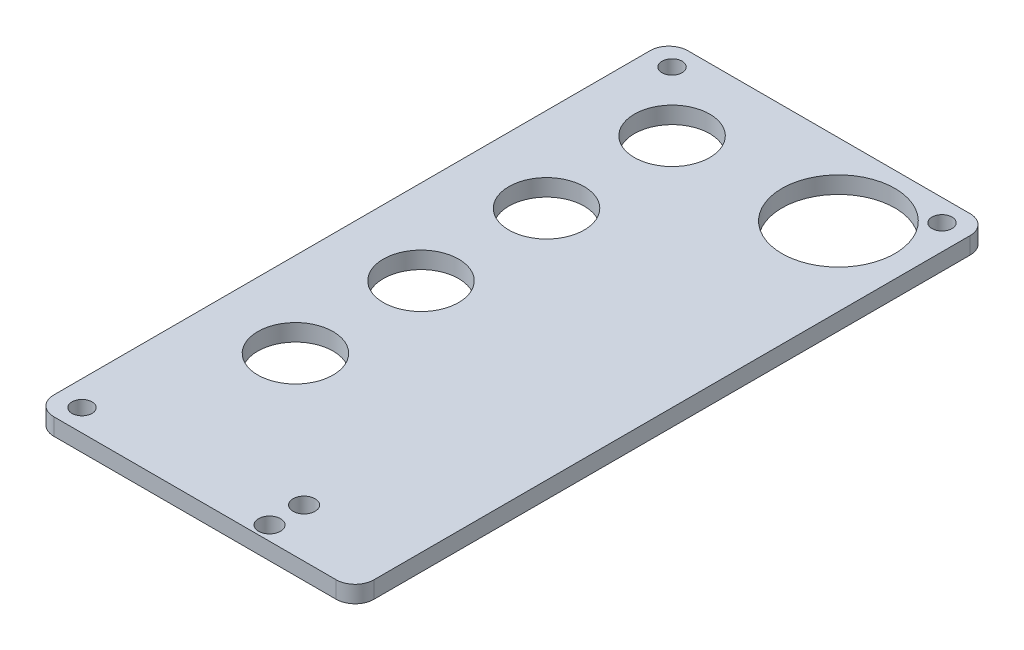
ISO-10303-21;
HEADER;
FILE_DESCRIPTION(('STEP AP214'),'2;1');
FILE_NAME('part.step','',(''),(''),'','','');
FILE_SCHEMA(('AUTOMOTIVE_DESIGN { 1 0 10303 214 1 1 1 1 }'));
ENDSEC;
DATA;
#1=APPLICATION_CONTEXT('core data for automotive mechanical design processes');
#2=APPLICATION_PROTOCOL_DEFINITION('international standard','automotive_design',2000,#1);
#3=PRODUCT_CONTEXT('',#1,'mechanical');
#4=PRODUCT('Part','Part','',(#3));
#5=PRODUCT_RELATED_PRODUCT_CATEGORY('part','',(#4));
#6=PRODUCT_DEFINITION_FORMATION('','',#4);
#7=PRODUCT_DEFINITION_CONTEXT('part definition',#1,'design');
#8=PRODUCT_DEFINITION('design','',#6,#7);
#9=PRODUCT_DEFINITION_SHAPE('','',#8);
#10=(LENGTH_UNIT() NAMED_UNIT(*) SI_UNIT(.MILLI.,.METRE.));
#11=(NAMED_UNIT(*) PLANE_ANGLE_UNIT() SI_UNIT($,.RADIAN.));
#12=(NAMED_UNIT(*) SI_UNIT($,.STERADIAN.) SOLID_ANGLE_UNIT());
#13=UNCERTAINTY_MEASURE_WITH_UNIT(LENGTH_MEASURE(1.E-05),#10,'distance_accuracy_value','');
#14=(GEOMETRIC_REPRESENTATION_CONTEXT(3) GLOBAL_UNCERTAINTY_ASSIGNED_CONTEXT((#13)) GLOBAL_UNIT_ASSIGNED_CONTEXT((#10,
#11,#12)) REPRESENTATION_CONTEXT('',''));
#15=CARTESIAN_POINT('',(0.,0.,0.));
#16=DIRECTION('',(0.,0.,1.));
#17=DIRECTION('',(1.,0.,0.));
#18=AXIS2_PLACEMENT_3D('',#15,#16,#17);
#19=CARTESIAN_POINT('',(0.,0.,0.));
#20=DIRECTION('',(0.,1.,0.));
#21=DIRECTION('',(1.,0.,0.));
#22=AXIS2_PLACEMENT_3D('',#19,#20,#21);
#23=PLANE('',#22);
#24=DIRECTION('',(-1.,0.,0.));
#25=VECTOR('',#24,1.);
#26=CARTESIAN_POINT('',(22.5,0.,-50.5));
#27=LINE('',#26,#25);
#28=CARTESIAN_POINT('',(22.5,0.,-50.5));
#29=VERTEX_POINT('',#28);
#30=CARTESIAN_POINT('',(-22.5,0.,-50.5));
#31=VERTEX_POINT('',#30);
#32=EDGE_CURVE('E35',#29,#31,#27,.T.);
#33=ORIENTED_EDGE('',*,*,#32,.F.);
#34=CARTESIAN_POINT('',(22.5,0.,-47.5));
#35=DIRECTION('',(0.,-1.,0.));
#36=DIRECTION('',(0.,0.,-1.));
#37=AXIS2_PLACEMENT_3D('',#34,#35,#36);
#38=CIRCLE('',#37,3.);
#39=CARTESIAN_POINT('',(25.5,0.,-47.5));
#40=VERTEX_POINT('',#39);
#41=EDGE_CURVE('E11',#29,#40,#38,.T.);
#42=ORIENTED_EDGE('',*,*,#41,.T.);
#43=DIRECTION('',(0.,0.,-1.));
#44=VECTOR('',#43,1.);
#45=CARTESIAN_POINT('',(25.5,0.,47.5));
#46=LINE('',#45,#44);
#47=CARTESIAN_POINT('',(25.5,0.,47.5));
#48=VERTEX_POINT('',#47);
#49=EDGE_CURVE('E120',#48,#40,#46,.T.);
#50=ORIENTED_EDGE('',*,*,#49,.F.);
#51=CARTESIAN_POINT('',(22.5,0.,47.5));
#52=DIRECTION('',(0.,-1.,0.));
#53=DIRECTION('',(1.,0.,0.));
#54=AXIS2_PLACEMENT_3D('',#51,#52,#53);
#55=CIRCLE('',#54,3.);
#56=CARTESIAN_POINT('',(22.5,0.,50.5));
#57=VERTEX_POINT('',#56);
#58=EDGE_CURVE('E27',#48,#57,#55,.T.);
#59=ORIENTED_EDGE('',*,*,#58,.T.);
#60=DIRECTION('',(1.,0.,0.));
#61=VECTOR('',#60,1.);
#62=CARTESIAN_POINT('',(-22.5,0.,50.5));
#63=LINE('',#62,#61);
#64=CARTESIAN_POINT('',(-22.5,0.,50.5));
#65=VERTEX_POINT('',#64);
#66=EDGE_CURVE('E123',#65,#57,#63,.T.);
#67=ORIENTED_EDGE('',*,*,#66,.F.);
#68=CARTESIAN_POINT('',(-22.5,0.,47.5));
#69=DIRECTION('',(0.,-1.,0.));
#70=DIRECTION('',(0.,0.,1.));
#71=AXIS2_PLACEMENT_3D('',#68,#69,#70);
#72=CIRCLE('',#71,3.);
#73=CARTESIAN_POINT('',(-25.5,0.,47.5));
#74=VERTEX_POINT('',#73);
#75=EDGE_CURVE('E139',#65,#74,#72,.T.);
#76=ORIENTED_EDGE('',*,*,#75,.T.);
#77=DIRECTION('',(0.,0.,1.));
#78=VECTOR('',#77,1.);
#79=CARTESIAN_POINT('',(-25.5,0.,-47.5));
#80=LINE('',#79,#78);
#81=CARTESIAN_POINT('',(-25.5,0.,-47.5));
#82=VERTEX_POINT('',#81);
#83=EDGE_CURVE('E130',#82,#74,#80,.T.);
#84=ORIENTED_EDGE('',*,*,#83,.F.);
#85=CARTESIAN_POINT('',(-22.5,0.,-47.5));
#86=DIRECTION('',(0.,-1.,0.));
#87=DIRECTION('',(-1.,0.,0.));
#88=AXIS2_PLACEMENT_3D('',#85,#86,#87);
#89=CIRCLE('',#88,3.);
#90=EDGE_CURVE('E140',#82,#31,#89,.T.);
#91=ORIENTED_EDGE('',*,*,#90,.T.);
#92=EDGE_LOOP('',(#33,#42,#50,#59,#67,#76,#84,#91));
#93=FACE_BOUND('',#92,.T.);
#94=CARTESIAN_POINT('',(21.5,0.,-47.));
#95=DIRECTION('',(0.,-1.,0.));
#96=DIRECTION('',(-1.,0.,0.));
#97=AXIS2_PLACEMENT_3D('',#94,#95,#96);
#98=CIRCLE('',#97,1.6);
#99=CARTESIAN_POINT('',(19.9,0.,-47.));
#100=VERTEX_POINT('',#99);
#101=EDGE_CURVE('E142',#100,#100,#98,.T.);
#102=ORIENTED_EDGE('',*,*,#101,.F.);
#103=EDGE_LOOP('',(#102));
#104=FACE_BOUND('',#103,.T.);
#105=CARTESIAN_POINT('',(-21.5,0.,-47.));
#106=DIRECTION('',(0.,-1.,0.));
#107=DIRECTION('',(-1.,0.,0.));
#108=AXIS2_PLACEMENT_3D('',#105,#106,#107);
#109=CIRCLE('',#108,1.6);
#110=CARTESIAN_POINT('',(-23.1,0.,-47.));
#111=VERTEX_POINT('',#110);
#112=EDGE_CURVE('E146',#111,#111,#109,.T.);
#113=ORIENTED_EDGE('',*,*,#112,.F.);
#114=EDGE_LOOP('',(#113));
#115=FACE_BOUND('',#114,.T.);
#116=CARTESIAN_POINT('',(-21.5,0.,47.));
#117=DIRECTION('',(0.,-1.,0.));
#118=DIRECTION('',(-1.,0.,0.));
#119=AXIS2_PLACEMENT_3D('',#116,#117,#118);
#120=CIRCLE('',#119,1.6);
#121=CARTESIAN_POINT('',(-23.1,0.,47.));
#122=VERTEX_POINT('',#121);
#123=EDGE_CURVE('E150',#122,#122,#120,.T.);
#124=ORIENTED_EDGE('',*,*,#123,.F.);
#125=EDGE_LOOP('',(#124));
#126=FACE_BOUND('',#125,.T.);
#127=CARTESIAN_POINT('',(-12.,0.,-37.5));
#128=DIRECTION('',(0.,-1.,0.));
#129=DIRECTION('',(-1.,0.,0.));
#130=AXIS2_PLACEMENT_3D('',#127,#128,#129);
#131=CIRCLE('',#130,6.);
#132=CARTESIAN_POINT('',(-18.,0.,-37.5));
#133=VERTEX_POINT('',#132);
#134=EDGE_CURVE('E153',#133,#133,#131,.T.);
#135=ORIENTED_EDGE('',*,*,#134,.F.);
#136=EDGE_LOOP('',(#135));
#137=FACE_BOUND('',#136,.T.);
#138=CARTESIAN_POINT('',(-12.,0.,-17.5));
#139=DIRECTION('',(0.,-1.,0.));
#140=DIRECTION('',(-1.,0.,0.));
#141=AXIS2_PLACEMENT_3D('',#138,#139,#140);
#142=CIRCLE('',#141,6.);
#143=CARTESIAN_POINT('',(-18.,0.,-17.5));
#144=VERTEX_POINT('',#143);
#145=EDGE_CURVE('E156',#144,#144,#142,.T.);
#146=ORIENTED_EDGE('',*,*,#145,.F.);
#147=EDGE_LOOP('',(#146));
#148=FACE_BOUND('',#147,.T.);
#149=CARTESIAN_POINT('',(-12.,0.,2.5));
#150=DIRECTION('',(0.,-1.,0.));
#151=DIRECTION('',(-1.,0.,0.));
#152=AXIS2_PLACEMENT_3D('',#149,#150,#151);
#153=CIRCLE('',#152,6.);
#154=CARTESIAN_POINT('',(-18.,0.,2.5));
#155=VERTEX_POINT('',#154);
#156=EDGE_CURVE('E159',#155,#155,#153,.T.);
#157=ORIENTED_EDGE('',*,*,#156,.F.);
#158=EDGE_LOOP('',(#157));
#159=FACE_BOUND('',#158,.T.);
#160=CARTESIAN_POINT('',(-12.,0.,22.5));
#161=DIRECTION('',(0.,-1.,0.));
#162=DIRECTION('',(-1.,0.,0.));
#163=AXIS2_PLACEMENT_3D('',#160,#161,#162);
#164=CIRCLE('',#163,6.);
#165=CARTESIAN_POINT('',(-18.,0.,22.5));
#166=VERTEX_POINT('',#165);
#167=EDGE_CURVE('E162',#166,#166,#164,.T.);
#168=ORIENTED_EDGE('',*,*,#167,.F.);
#169=EDGE_LOOP('',(#168));
#170=FACE_BOUND('',#169,.T.);
#171=CARTESIAN_POINT('',(13.,0.,-39.));
#172=DIRECTION('',(0.,-1.,0.));
#173=DIRECTION('',(-1.,0.,0.));
#174=AXIS2_PLACEMENT_3D('',#171,#172,#173);
#175=CIRCLE('',#174,9.);
#176=CARTESIAN_POINT('',(4.,0.,-39.));
#177=VERTEX_POINT('',#176);
#178=EDGE_CURVE('E165',#177,#177,#175,.T.);
#179=ORIENTED_EDGE('',*,*,#178,.F.);
#180=EDGE_LOOP('',(#179));
#181=FACE_BOUND('',#180,.T.);
#182=CARTESIAN_POINT('',(9.624,0.,42.75));
#183=DIRECTION('',(0.,-1.,0.));
#184=DIRECTION('',(-1.,0.,0.));
#185=AXIS2_PLACEMENT_3D('',#182,#183,#184);
#186=CIRCLE('',#185,1.75);
#187=CARTESIAN_POINT('',(7.874,0.,42.75));
#188=VERTEX_POINT('',#187);
#189=EDGE_CURVE('E108',#188,#188,#186,.T.);
#190=ORIENTED_EDGE('',*,*,#189,.F.);
#191=EDGE_LOOP('',(#190));
#192=FACE_BOUND('',#191,.T.);
#193=CARTESIAN_POINT('',(9.624,0.,48.25));
#194=DIRECTION('',(0.,-1.,0.));
#195=DIRECTION('',(-1.,0.,0.));
#196=AXIS2_PLACEMENT_3D('',#193,#194,#195);
#197=CIRCLE('',#196,1.75);
#198=CARTESIAN_POINT('',(7.874,0.,48.25));
#199=VERTEX_POINT('',#198);
#200=EDGE_CURVE('E104',#199,#199,#197,.T.);
#201=ORIENTED_EDGE('',*,*,#200,.F.);
#202=EDGE_LOOP('',(#201));
#203=FACE_BOUND('',#202,.T.);
#204=ADVANCED_FACE('F17',(#93,#104,#115,#126,#137,#148,#159,#170,#181,#192,#203),#23,.F.);
#205=CARTESIAN_POINT('',(21.5,0.,-47.));
#206=DIRECTION('',(0.,1.,0.));
#207=DIRECTION('',(1.,0.,0.));
#208=AXIS2_PLACEMENT_3D('',#205,#206,#207);
#209=CYLINDRICAL_SURFACE('',#208,1.6);
#210=CARTESIAN_POINT('',(21.5,2.7,-47.));
#211=DIRECTION('',(0.,-1.,0.));
#212=DIRECTION('',(1.,0.,0.));
#213=AXIS2_PLACEMENT_3D('',#210,#211,#212);
#214=CIRCLE('',#213,1.6);
#215=CARTESIAN_POINT('',(23.1,2.7,-47.));
#216=VERTEX_POINT('',#215);
#217=EDGE_CURVE('E95',#216,#216,#214,.T.);
#218=ORIENTED_EDGE('',*,*,#217,.F.);
#219=EDGE_LOOP('',(#218));
#220=FACE_BOUND('',#219,.T.);
#221=ORIENTED_EDGE('',*,*,#101,.T.);
#222=EDGE_LOOP('',(#221));
#223=FACE_BOUND('',#222,.T.);
#224=ADVANCED_FACE('F220',(#220,#223),#209,.F.);
#225=CARTESIAN_POINT('',(0.,2.7,0.));
#226=DIRECTION('',(0.,1.,0.));
#227=DIRECTION('',(1.,0.,0.));
#228=AXIS2_PLACEMENT_3D('',#225,#226,#227);
#229=PLANE('',#228);
#230=DIRECTION('',(0.,0.,1.));
#231=VECTOR('',#230,1.);
#232=CARTESIAN_POINT('',(-25.5,2.7,-47.5));
#233=LINE('',#232,#231);
#234=CARTESIAN_POINT('',(-25.5,2.7,-47.5));
#235=VERTEX_POINT('',#234);
#236=CARTESIAN_POINT('',(-25.5,2.7,47.5));
#237=VERTEX_POINT('',#236);
#238=EDGE_CURVE('E145',#235,#237,#233,.T.);
#239=ORIENTED_EDGE('',*,*,#238,.T.);
#240=CARTESIAN_POINT('',(-22.5,2.7,47.5));
#241=DIRECTION('',(0.,1.,0.));
#242=DIRECTION('',(-1.,0.,0.));
#243=AXIS2_PLACEMENT_3D('',#240,#241,#242);
#244=CIRCLE('',#243,3.);
#245=CARTESIAN_POINT('',(-22.5,2.7,50.5));
#246=VERTEX_POINT('',#245);
#247=EDGE_CURVE('E174',#237,#246,#244,.T.);
#248=ORIENTED_EDGE('',*,*,#247,.T.);
#249=DIRECTION('',(1.,0.,0.));
#250=VECTOR('',#249,1.);
#251=CARTESIAN_POINT('',(-22.5,2.7,50.5));
#252=LINE('',#251,#250);
#253=CARTESIAN_POINT('',(22.5,2.7,50.5));
#254=VERTEX_POINT('',#253);
#255=EDGE_CURVE('E177',#246,#254,#252,.T.);
#256=ORIENTED_EDGE('',*,*,#255,.T.);
#257=CARTESIAN_POINT('',(22.5,2.7,47.5));
#258=DIRECTION('',(0.,1.,0.));
#259=DIRECTION('',(0.,0.,1.));
#260=AXIS2_PLACEMENT_3D('',#257,#258,#259);
#261=CIRCLE('',#260,3.);
#262=CARTESIAN_POINT('',(25.5,2.7,47.5));
#263=VERTEX_POINT('',#262);
#264=EDGE_CURVE('E180',#254,#263,#261,.T.);
#265=ORIENTED_EDGE('',*,*,#264,.T.);
#266=DIRECTION('',(0.,0.,-1.));
#267=VECTOR('',#266,1.);
#268=CARTESIAN_POINT('',(25.5,2.7,47.5));
#269=LINE('',#268,#267);
#270=CARTESIAN_POINT('',(25.5,2.7,-47.5));
#271=VERTEX_POINT('',#270);
#272=EDGE_CURVE('E183',#263,#271,#269,.T.);
#273=ORIENTED_EDGE('',*,*,#272,.T.);
#274=CARTESIAN_POINT('',(22.5,2.7,-47.5));
#275=DIRECTION('',(0.,1.,0.));
#276=DIRECTION('',(1.,0.,0.));
#277=AXIS2_PLACEMENT_3D('',#274,#275,#276);
#278=CIRCLE('',#277,3.);
#279=CARTESIAN_POINT('',(22.5,2.7,-50.5));
#280=VERTEX_POINT('',#279);
#281=EDGE_CURVE('E100',#271,#280,#278,.T.);
#282=ORIENTED_EDGE('',*,*,#281,.T.);
#283=DIRECTION('',(-1.,0.,0.));
#284=VECTOR('',#283,1.);
#285=CARTESIAN_POINT('',(22.5,2.7,-50.5));
#286=LINE('',#285,#284);
#287=CARTESIAN_POINT('',(-22.5,2.7,-50.5));
#288=VERTEX_POINT('',#287);
#289=EDGE_CURVE('E80',#280,#288,#286,.T.);
#290=ORIENTED_EDGE('',*,*,#289,.T.);
#291=CARTESIAN_POINT('',(-22.5,2.7,-47.5));
#292=DIRECTION('',(0.,1.,0.));
#293=DIRECTION('',(0.,0.,-1.));
#294=AXIS2_PLACEMENT_3D('',#291,#292,#293);
#295=CIRCLE('',#294,3.);
#296=EDGE_CURVE('E86',#288,#235,#295,.T.);
#297=ORIENTED_EDGE('',*,*,#296,.T.);
#298=EDGE_LOOP('',(#239,#248,#256,#265,#273,#282,#290,#297));
#299=FACE_BOUND('',#298,.T.);
#300=ORIENTED_EDGE('',*,*,#217,.T.);
#301=EDGE_LOOP('',(#300));
#302=FACE_BOUND('',#301,.T.);
#303=CARTESIAN_POINT('',(-21.5,2.7,-47.));
#304=DIRECTION('',(0.,-1.,0.));
#305=DIRECTION('',(-1.,0.,0.));
#306=AXIS2_PLACEMENT_3D('',#303,#304,#305);
#307=CIRCLE('',#306,1.6);
#308=CARTESIAN_POINT('',(-23.1,2.7,-47.));
#309=VERTEX_POINT('',#308);
#310=EDGE_CURVE('E172',#309,#309,#307,.T.);
#311=ORIENTED_EDGE('',*,*,#310,.T.);
#312=EDGE_LOOP('',(#311));
#313=FACE_BOUND('',#312,.T.);
#314=CARTESIAN_POINT('',(-21.5,2.7,47.));
#315=DIRECTION('',(0.,-1.,0.));
#316=DIRECTION('',(-1.,0.,0.));
#317=AXIS2_PLACEMENT_3D('',#314,#315,#316);
#318=CIRCLE('',#317,1.6);
#319=CARTESIAN_POINT('',(-23.1,2.7,47.));
#320=VERTEX_POINT('',#319);
#321=EDGE_CURVE('E188',#320,#320,#318,.T.);
#322=ORIENTED_EDGE('',*,*,#321,.T.);
#323=EDGE_LOOP('',(#322));
#324=FACE_BOUND('',#323,.T.);
#325=CARTESIAN_POINT('',(-12.,2.7,-37.5));
#326=DIRECTION('',(0.,-1.,0.));
#327=DIRECTION('',(-1.,0.,0.));
#328=AXIS2_PLACEMENT_3D('',#325,#326,#327);
#329=CIRCLE('',#328,6.);
#330=CARTESIAN_POINT('',(-18.,2.7,-37.5));
#331=VERTEX_POINT('',#330);
#332=EDGE_CURVE('E191',#331,#331,#329,.T.);
#333=ORIENTED_EDGE('',*,*,#332,.T.);
#334=EDGE_LOOP('',(#333));
#335=FACE_BOUND('',#334,.T.);
#336=CARTESIAN_POINT('',(-12.,2.7,-17.5));
#337=DIRECTION('',(0.,-1.,0.));
#338=DIRECTION('',(-1.,0.,0.));
#339=AXIS2_PLACEMENT_3D('',#336,#337,#338);
#340=CIRCLE('',#339,6.);
#341=CARTESIAN_POINT('',(-18.,2.7,-17.5));
#342=VERTEX_POINT('',#341);
#343=EDGE_CURVE('E194',#342,#342,#340,.T.);
#344=ORIENTED_EDGE('',*,*,#343,.T.);
#345=EDGE_LOOP('',(#344));
#346=FACE_BOUND('',#345,.T.);
#347=CARTESIAN_POINT('',(-12.,2.7,2.5));
#348=DIRECTION('',(0.,-1.,0.));
#349=DIRECTION('',(-1.,0.,0.));
#350=AXIS2_PLACEMENT_3D('',#347,#348,#349);
#351=CIRCLE('',#350,6.);
#352=CARTESIAN_POINT('',(-18.,2.7,2.5));
#353=VERTEX_POINT('',#352);
#354=EDGE_CURVE('E197',#353,#353,#351,.T.);
#355=ORIENTED_EDGE('',*,*,#354,.T.);
#356=EDGE_LOOP('',(#355));
#357=FACE_BOUND('',#356,.T.);
#358=CARTESIAN_POINT('',(-12.,2.7,22.5));
#359=DIRECTION('',(0.,-1.,0.));
#360=DIRECTION('',(-1.,0.,0.));
#361=AXIS2_PLACEMENT_3D('',#358,#359,#360);
#362=CIRCLE('',#361,6.);
#363=CARTESIAN_POINT('',(-18.,2.7,22.5));
#364=VERTEX_POINT('',#363);
#365=EDGE_CURVE('E200',#364,#364,#362,.T.);
#366=ORIENTED_EDGE('',*,*,#365,.T.);
#367=EDGE_LOOP('',(#366));
#368=FACE_BOUND('',#367,.T.);
#369=CARTESIAN_POINT('',(13.,2.7,-39.));
#370=DIRECTION('',(0.,-1.,0.));
#371=DIRECTION('',(-1.,0.,0.));
#372=AXIS2_PLACEMENT_3D('',#369,#370,#371);
#373=CIRCLE('',#372,9.);
#374=CARTESIAN_POINT('',(4.,2.7,-39.));
#375=VERTEX_POINT('',#374);
#376=EDGE_CURVE('E203',#375,#375,#373,.T.);
#377=ORIENTED_EDGE('',*,*,#376,.T.);
#378=EDGE_LOOP('',(#377));
#379=FACE_BOUND('',#378,.T.);
#380=CARTESIAN_POINT('',(9.624,2.7,42.75));
#381=DIRECTION('',(0.,-1.,0.));
#382=DIRECTION('',(-1.,0.,0.));
#383=AXIS2_PLACEMENT_3D('',#380,#381,#382);
#384=CIRCLE('',#383,1.75);
#385=CARTESIAN_POINT('',(7.874,2.7,42.75));
#386=VERTEX_POINT('',#385);
#387=EDGE_CURVE('E206',#386,#386,#384,.T.);
#388=ORIENTED_EDGE('',*,*,#387,.T.);
#389=EDGE_LOOP('',(#388));
#390=FACE_BOUND('',#389,.T.);
#391=CARTESIAN_POINT('',(9.624,2.7,48.25));
#392=DIRECTION('',(0.,-1.,0.));
#393=DIRECTION('',(-1.,0.,0.));
#394=AXIS2_PLACEMENT_3D('',#391,#392,#393);
#395=CIRCLE('',#394,1.75);
#396=CARTESIAN_POINT('',(7.874,2.7,48.25));
#397=VERTEX_POINT('',#396);
#398=EDGE_CURVE('E149',#397,#397,#395,.T.);
#399=ORIENTED_EDGE('',*,*,#398,.T.);
#400=EDGE_LOOP('',(#399));
#401=FACE_BOUND('',#400,.T.);
#402=ADVANCED_FACE('F97',(#299,#302,#313,#324,#335,#346,#357,#368,#379,#390,#401),#229,.T.);
#403=CARTESIAN_POINT('',(-21.5,0.,-47.));
#404=DIRECTION('',(0.,1.,0.));
#405=DIRECTION('',(1.,0.,0.));
#406=AXIS2_PLACEMENT_3D('',#403,#404,#405);
#407=CYLINDRICAL_SURFACE('',#406,1.6);
#408=ORIENTED_EDGE('',*,*,#310,.F.);
#409=EDGE_LOOP('',(#408));
#410=FACE_BOUND('',#409,.T.);
#411=ORIENTED_EDGE('',*,*,#112,.T.);
#412=EDGE_LOOP('',(#411));
#413=FACE_BOUND('',#412,.T.);
#414=ADVANCED_FACE('F232',(#410,#413),#407,.F.);
#415=CARTESIAN_POINT('',(-21.5,0.,47.));
#416=DIRECTION('',(0.,1.,0.));
#417=DIRECTION('',(1.,0.,0.));
#418=AXIS2_PLACEMENT_3D('',#415,#416,#417);
#419=CYLINDRICAL_SURFACE('',#418,1.6);
#420=ORIENTED_EDGE('',*,*,#321,.F.);
#421=EDGE_LOOP('',(#420));
#422=FACE_BOUND('',#421,.T.);
#423=ORIENTED_EDGE('',*,*,#123,.T.);
#424=EDGE_LOOP('',(#423));
#425=FACE_BOUND('',#424,.T.);
#426=ADVANCED_FACE('F235',(#422,#425),#419,.F.);
#427=CARTESIAN_POINT('',(-12.,0.,-37.5));
#428=DIRECTION('',(0.,1.,0.));
#429=DIRECTION('',(1.,0.,0.));
#430=AXIS2_PLACEMENT_3D('',#427,#428,#429);
#431=CYLINDRICAL_SURFACE('',#430,6.);
#432=ORIENTED_EDGE('',*,*,#332,.F.);
#433=EDGE_LOOP('',(#432));
#434=FACE_BOUND('',#433,.T.);
#435=ORIENTED_EDGE('',*,*,#134,.T.);
#436=EDGE_LOOP('',(#435));
#437=FACE_BOUND('',#436,.T.);
#438=ADVANCED_FACE('F239',(#434,#437),#431,.F.);
#439=CARTESIAN_POINT('',(-12.,0.,-17.5));
#440=DIRECTION('',(0.,1.,0.));
#441=DIRECTION('',(1.,0.,0.));
#442=AXIS2_PLACEMENT_3D('',#439,#440,#441);
#443=CYLINDRICAL_SURFACE('',#442,6.);
#444=ORIENTED_EDGE('',*,*,#343,.F.);
#445=EDGE_LOOP('',(#444));
#446=FACE_BOUND('',#445,.T.);
#447=ORIENTED_EDGE('',*,*,#145,.T.);
#448=EDGE_LOOP('',(#447));
#449=FACE_BOUND('',#448,.T.);
#450=ADVANCED_FACE('F243',(#446,#449),#443,.F.);
#451=CARTESIAN_POINT('',(-12.,0.,2.5));
#452=DIRECTION('',(0.,1.,0.));
#453=DIRECTION('',(1.,0.,0.));
#454=AXIS2_PLACEMENT_3D('',#451,#452,#453);
#455=CYLINDRICAL_SURFACE('',#454,6.);
#456=ORIENTED_EDGE('',*,*,#354,.F.);
#457=EDGE_LOOP('',(#456));
#458=FACE_BOUND('',#457,.T.);
#459=ORIENTED_EDGE('',*,*,#156,.T.);
#460=EDGE_LOOP('',(#459));
#461=FACE_BOUND('',#460,.T.);
#462=ADVANCED_FACE('F247',(#458,#461),#455,.F.);
#463=CARTESIAN_POINT('',(-12.,0.,22.5));
#464=DIRECTION('',(0.,1.,0.));
#465=DIRECTION('',(1.,0.,0.));
#466=AXIS2_PLACEMENT_3D('',#463,#464,#465);
#467=CYLINDRICAL_SURFACE('',#466,6.);
#468=ORIENTED_EDGE('',*,*,#365,.F.);
#469=EDGE_LOOP('',(#468));
#470=FACE_BOUND('',#469,.T.);
#471=ORIENTED_EDGE('',*,*,#167,.T.);
#472=EDGE_LOOP('',(#471));
#473=FACE_BOUND('',#472,.T.);
#474=ADVANCED_FACE('F251',(#470,#473),#467,.F.);
#475=CARTESIAN_POINT('',(13.,0.,-39.));
#476=DIRECTION('',(0.,1.,0.));
#477=DIRECTION('',(1.,0.,0.));
#478=AXIS2_PLACEMENT_3D('',#475,#476,#477);
#479=CYLINDRICAL_SURFACE('',#478,9.);
#480=ORIENTED_EDGE('',*,*,#376,.F.);
#481=EDGE_LOOP('',(#480));
#482=FACE_BOUND('',#481,.T.);
#483=ORIENTED_EDGE('',*,*,#178,.T.);
#484=EDGE_LOOP('',(#483));
#485=FACE_BOUND('',#484,.T.);
#486=ADVANCED_FACE('F255',(#482,#485),#479,.F.);
#487=CARTESIAN_POINT('',(9.624,0.,42.75));
#488=DIRECTION('',(0.,1.,0.));
#489=DIRECTION('',(1.,0.,0.));
#490=AXIS2_PLACEMENT_3D('',#487,#488,#489);
#491=CYLINDRICAL_SURFACE('',#490,1.75);
#492=ORIENTED_EDGE('',*,*,#387,.F.);
#493=EDGE_LOOP('',(#492));
#494=FACE_BOUND('',#493,.T.);
#495=ORIENTED_EDGE('',*,*,#189,.T.);
#496=EDGE_LOOP('',(#495));
#497=FACE_BOUND('',#496,.T.);
#498=ADVANCED_FACE('F215',(#494,#497),#491,.F.);
#499=CARTESIAN_POINT('',(9.624,0.,48.25));
#500=DIRECTION('',(0.,1.,0.));
#501=DIRECTION('',(1.,0.,0.));
#502=AXIS2_PLACEMENT_3D('',#499,#500,#501);
#503=CYLINDRICAL_SURFACE('',#502,1.75);
#504=ORIENTED_EDGE('',*,*,#398,.F.);
#505=EDGE_LOOP('',(#504));
#506=FACE_BOUND('',#505,.T.);
#507=ORIENTED_EDGE('',*,*,#200,.T.);
#508=EDGE_LOOP('',(#507));
#509=FACE_BOUND('',#508,.T.);
#510=ADVANCED_FACE('F212',(#506,#509),#503,.F.);
#511=CARTESIAN_POINT('',(-22.5,6.58044,-47.5));
#512=DIRECTION('',(0.,-1.,0.));
#513=DIRECTION('',(-1.,0.,0.));
#514=AXIS2_PLACEMENT_3D('',#511,#512,#513);
#515=CYLINDRICAL_SURFACE('',#514,3.);
#516=DIRECTION('',(0.,-1.,0.));
#517=VECTOR('',#516,1.);
#518=CARTESIAN_POINT('',(-25.5,2.7,-47.5));
#519=LINE('',#518,#517);
#520=EDGE_CURVE('E91',#235,#82,#519,.T.);
#521=ORIENTED_EDGE('',*,*,#520,.F.);
#522=ORIENTED_EDGE('',*,*,#296,.F.);
#523=DIRECTION('',(0.,-1.,0.));
#524=VECTOR('',#523,1.);
#525=CARTESIAN_POINT('',(-22.5,2.7,-50.5));
#526=LINE('',#525,#524);
#527=EDGE_CURVE('E89',#288,#31,#526,.T.);
#528=ORIENTED_EDGE('',*,*,#527,.T.);
#529=ORIENTED_EDGE('',*,*,#90,.F.);
#530=EDGE_LOOP('',(#521,#522,#528,#529));
#531=FACE_BOUND('',#530,.T.);
#532=ADVANCED_FACE('F87',(#531),#515,.T.);
#533=CARTESIAN_POINT('',(25.5,0.,-50.5));
#534=DIRECTION('',(0.,0.,-1.));
#535=DIRECTION('',(-1.,0.,0.));
#536=AXIS2_PLACEMENT_3D('',#533,#534,#535);
#537=PLANE('',#536);
#538=ORIENTED_EDGE('',*,*,#289,.F.);
#539=DIRECTION('',(0.,-1.,0.));
#540=VECTOR('',#539,1.);
#541=CARTESIAN_POINT('',(22.5,2.7,-50.5));
#542=LINE('',#541,#540);
#543=EDGE_CURVE('E105',#280,#29,#542,.T.);
#544=ORIENTED_EDGE('',*,*,#543,.T.);
#545=ORIENTED_EDGE('',*,*,#32,.T.);
#546=ORIENTED_EDGE('',*,*,#527,.F.);
#547=EDGE_LOOP('',(#538,#544,#545,#546));
#548=FACE_BOUND('',#547,.T.);
#549=ADVANCED_FACE('F103',(#548),#537,.T.);
#550=CARTESIAN_POINT('',(22.5,6.58044,-47.5));
#551=DIRECTION('',(0.,-1.,0.));
#552=DIRECTION('',(0.,0.,-1.));
#553=AXIS2_PLACEMENT_3D('',#550,#551,#552);
#554=CYLINDRICAL_SURFACE('',#553,3.);
#555=ORIENTED_EDGE('',*,*,#543,.F.);
#556=ORIENTED_EDGE('',*,*,#281,.F.);
#557=DIRECTION('',(0.,-1.,0.));
#558=VECTOR('',#557,1.);
#559=CARTESIAN_POINT('',(25.5,2.7,-47.5));
#560=LINE('',#559,#558);
#561=EDGE_CURVE('E114',#271,#40,#560,.T.);
#562=ORIENTED_EDGE('',*,*,#561,.T.);
#563=ORIENTED_EDGE('',*,*,#41,.F.);
#564=EDGE_LOOP('',(#555,#556,#562,#563));
#565=FACE_BOUND('',#564,.T.);
#566=ADVANCED_FACE('F267',(#565),#554,.T.);
#567=CARTESIAN_POINT('',(25.5,0.,50.5));
#568=DIRECTION('',(1.,0.,0.));
#569=DIRECTION('',(0.,0.,-1.));
#570=AXIS2_PLACEMENT_3D('',#567,#568,#569);
#571=PLANE('',#570);
#572=ORIENTED_EDGE('',*,*,#272,.F.);
#573=DIRECTION('',(0.,-1.,0.));
#574=VECTOR('',#573,1.);
#575=CARTESIAN_POINT('',(25.5,2.7,47.5));
#576=LINE('',#575,#574);
#577=EDGE_CURVE('E117',#263,#48,#576,.T.);
#578=ORIENTED_EDGE('',*,*,#577,.T.);
#579=ORIENTED_EDGE('',*,*,#49,.T.);
#580=ORIENTED_EDGE('',*,*,#561,.F.);
#581=EDGE_LOOP('',(#572,#578,#579,#580));
#582=FACE_BOUND('',#581,.T.);
#583=ADVANCED_FACE('F270',(#582),#571,.T.);
#584=CARTESIAN_POINT('',(22.5,6.58044,47.5));
#585=DIRECTION('',(0.,-1.,0.));
#586=DIRECTION('',(1.,0.,0.));
#587=AXIS2_PLACEMENT_3D('',#584,#585,#586);
#588=CYLINDRICAL_SURFACE('',#587,3.);
#589=ORIENTED_EDGE('',*,*,#577,.F.);
#590=ORIENTED_EDGE('',*,*,#264,.F.);
#591=DIRECTION('',(0.,-1.,0.));
#592=VECTOR('',#591,1.);
#593=CARTESIAN_POINT('',(22.5,2.7,50.5));
#594=LINE('',#593,#592);
#595=EDGE_CURVE('E121',#254,#57,#594,.T.);
#596=ORIENTED_EDGE('',*,*,#595,.T.);
#597=ORIENTED_EDGE('',*,*,#58,.F.);
#598=EDGE_LOOP('',(#589,#590,#596,#597));
#599=FACE_BOUND('',#598,.T.);
#600=ADVANCED_FACE('F274',(#599),#588,.T.);
#601=CARTESIAN_POINT('',(-25.5,0.,50.5));
#602=DIRECTION('',(0.,0.,1.));
#603=DIRECTION('',(1.,0.,0.));
#604=AXIS2_PLACEMENT_3D('',#601,#602,#603);
#605=PLANE('',#604);
#606=ORIENTED_EDGE('',*,*,#66,.T.);
#607=ORIENTED_EDGE('',*,*,#595,.F.);
#608=ORIENTED_EDGE('',*,*,#255,.F.);
#609=DIRECTION('',(0.,-1.,0.));
#610=VECTOR('',#609,1.);
#611=CARTESIAN_POINT('',(-22.5,2.7,50.5));
#612=LINE('',#611,#610);
#613=EDGE_CURVE('E124',#246,#65,#612,.T.);
#614=ORIENTED_EDGE('',*,*,#613,.T.);
#615=EDGE_LOOP('',(#606,#607,#608,#614));
#616=FACE_BOUND('',#615,.T.);
#617=ADVANCED_FACE('F278',(#616),#605,.T.);
#618=CARTESIAN_POINT('',(-22.5,6.58044,47.5));
#619=DIRECTION('',(0.,-1.,0.));
#620=DIRECTION('',(0.,0.,1.));
#621=AXIS2_PLACEMENT_3D('',#618,#619,#620);
#622=CYLINDRICAL_SURFACE('',#621,3.);
#623=ORIENTED_EDGE('',*,*,#613,.F.);
#624=ORIENTED_EDGE('',*,*,#247,.F.);
#625=DIRECTION('',(0.,-1.,0.));
#626=VECTOR('',#625,1.);
#627=CARTESIAN_POINT('',(-25.5,2.7,47.5));
#628=LINE('',#627,#626);
#629=EDGE_CURVE('E21',#237,#74,#628,.T.);
#630=ORIENTED_EDGE('',*,*,#629,.T.);
#631=ORIENTED_EDGE('',*,*,#75,.F.);
#632=EDGE_LOOP('',(#623,#624,#630,#631));
#633=FACE_BOUND('',#632,.T.);
#634=ADVANCED_FACE('F281',(#633),#622,.T.);
#635=CARTESIAN_POINT('',(-25.5,0.,-50.5));
#636=DIRECTION('',(-1.,0.,0.));
#637=DIRECTION('',(0.,0.,1.));
#638=AXIS2_PLACEMENT_3D('',#635,#636,#637);
#639=PLANE('',#638);
#640=ORIENTED_EDGE('',*,*,#83,.T.);
#641=ORIENTED_EDGE('',*,*,#629,.F.);
#642=ORIENTED_EDGE('',*,*,#238,.F.);
#643=ORIENTED_EDGE('',*,*,#520,.T.);
#644=EDGE_LOOP('',(#640,#641,#642,#643));
#645=FACE_BOUND('',#644,.T.);
#646=ADVANCED_FACE('F19',(#645),#639,.T.);
#647=CLOSED_SHELL('',(#204,#224,#402,#414,#426,#438,#450,#462,#474,#486,#498,#510,#532,#549,
#566,#583,#600,#617,#634,#646));
#648=MANIFOLD_SOLID_BREP('B1',#647);
#649=ADVANCED_BREP_SHAPE_REPRESENTATION('',(#18,#648),#14);
#650=SHAPE_DEFINITION_REPRESENTATION(#9,#649);
ENDSEC;
END-ISO-10303-21;
